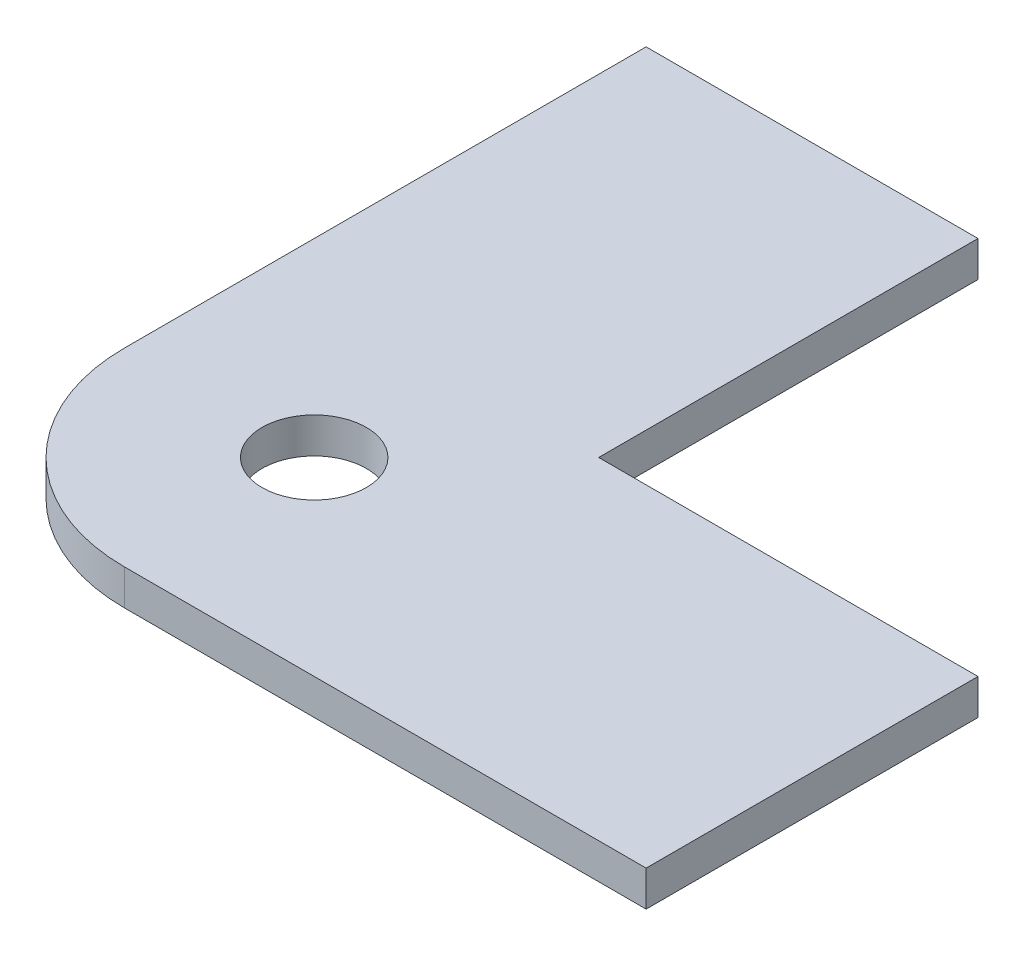
ISO-10303-21;
HEADER;
FILE_DESCRIPTION(('STEP AP214'),'2;1');
FILE_NAME('part.step','',(''),(''),'','','');
FILE_SCHEMA(('AUTOMOTIVE_DESIGN { 1 0 10303 214 1 1 1 1 }'));
ENDSEC;
DATA;
#1=APPLICATION_CONTEXT('core data for automotive mechanical design processes');
#2=APPLICATION_PROTOCOL_DEFINITION('international standard','automotive_design',2000,#1);
#3=PRODUCT_CONTEXT('',#1,'mechanical');
#4=PRODUCT('Part','Part','',(#3));
#5=PRODUCT_RELATED_PRODUCT_CATEGORY('part','',(#4));
#6=PRODUCT_DEFINITION_FORMATION('','',#4);
#7=PRODUCT_DEFINITION_CONTEXT('part definition',#1,'design');
#8=PRODUCT_DEFINITION('design','',#6,#7);
#9=PRODUCT_DEFINITION_SHAPE('','',#8);
#10=(LENGTH_UNIT() NAMED_UNIT(*) SI_UNIT(.MILLI.,.METRE.));
#11=(NAMED_UNIT(*) PLANE_ANGLE_UNIT() SI_UNIT($,.RADIAN.));
#12=(NAMED_UNIT(*) SI_UNIT($,.STERADIAN.) SOLID_ANGLE_UNIT());
#13=UNCERTAINTY_MEASURE_WITH_UNIT(LENGTH_MEASURE(1.E-05),#10,'distance_accuracy_value','');
#14=(GEOMETRIC_REPRESENTATION_CONTEXT(3) GLOBAL_UNCERTAINTY_ASSIGNED_CONTEXT((#13)) GLOBAL_UNIT_ASSIGNED_CONTEXT((#10,
#11,#12)) REPRESENTATION_CONTEXT('',''));
#15=CARTESIAN_POINT('',(0.,0.,0.));
#16=DIRECTION('',(0.,0.,1.));
#17=DIRECTION('',(1.,0.,0.));
#18=AXIS2_PLACEMENT_3D('',#15,#16,#17);
#19=CARTESIAN_POINT('',(0.,0.75,3.99967418048264));
#20=DIRECTION('',(0.,0.,-1.));
#21=DIRECTION('',(-1.,0.,0.));
#22=AXIS2_PLACEMENT_3D('',#19,#20,#21);
#23=PLANE('',#22);
#24=DIRECTION('',(1.,0.,0.));
#25=VECTOR('',#24,1.);
#26=CARTESIAN_POINT('',(0.,0.,3.99967418048264));
#27=LINE('',#26,#25);
#28=CARTESIAN_POINT('',(0.,0.,3.99967418048264));
#29=VERTEX_POINT('',#28);
#30=CARTESIAN_POINT('',(11.,0.,3.99967418048264));
#31=VERTEX_POINT('',#30);
#32=EDGE_CURVE('E142',#29,#31,#27,.T.);
#33=ORIENTED_EDGE('',*,*,#32,.T.);
#34=DIRECTION('',(0.,-1.,0.));
#35=VECTOR('',#34,1.);
#36=CARTESIAN_POINT('',(11.,0.75,3.99967418048264));
#37=LINE('',#36,#35);
#38=CARTESIAN_POINT('',(11.,0.75,3.99967418048264));
#39=VERTEX_POINT('',#38);
#40=EDGE_CURVE('E11',#39,#31,#37,.T.);
#41=ORIENTED_EDGE('',*,*,#40,.F.);
#42=DIRECTION('',(1.,0.,0.));
#43=VECTOR('',#42,1.);
#44=CARTESIAN_POINT('',(0.,0.75,3.99967418048264));
#45=LINE('',#44,#43);
#46=CARTESIAN_POINT('',(0.,0.75,3.99967418048264));
#47=VERTEX_POINT('',#46);
#48=EDGE_CURVE('E170',#47,#39,#45,.T.);
#49=ORIENTED_EDGE('',*,*,#48,.F.);
#50=DIRECTION('',(0.,-1.,0.));
#51=VECTOR('',#50,1.);
#52=CARTESIAN_POINT('',(0.,0.75,3.99967418048264));
#53=LINE('',#52,#51);
#54=EDGE_CURVE('E58',#47,#29,#53,.T.);
#55=ORIENTED_EDGE('',*,*,#54,.T.);
#56=EDGE_LOOP('',(#33,#41,#49,#55));
#57=FACE_BOUND('',#56,.T.);
#58=ADVANCED_FACE('F41',(#57),#23,.F.);
#59=CARTESIAN_POINT('',(11.,0.75,0.));
#60=DIRECTION('',(-1.,0.,0.));
#61=DIRECTION('',(0.,0.,1.));
#62=AXIS2_PLACEMENT_3D('',#59,#60,#61);
#63=PLANE('',#62);
#64=DIRECTION('',(0.,0.,-1.));
#65=VECTOR('',#64,1.);
#66=CARTESIAN_POINT('',(11.,0.,0.));
#67=LINE('',#66,#65);
#68=CARTESIAN_POINT('',(11.,0.,-3.));
#69=VERTEX_POINT('',#68);
#70=EDGE_CURVE('E145',#31,#69,#67,.T.);
#71=ORIENTED_EDGE('',*,*,#70,.T.);
#72=DIRECTION('',(0.,-1.,0.));
#73=VECTOR('',#72,1.);
#74=CARTESIAN_POINT('',(11.,0.75,-3.));
#75=LINE('',#74,#73);
#76=CARTESIAN_POINT('',(11.,0.75,-3.));
#77=VERTEX_POINT('',#76);
#78=EDGE_CURVE('E50',#77,#69,#75,.T.);
#79=ORIENTED_EDGE('',*,*,#78,.F.);
#80=DIRECTION('',(0.,0.,-1.));
#81=VECTOR('',#80,1.);
#82=CARTESIAN_POINT('',(11.,0.75,0.));
#83=LINE('',#82,#81);
#84=EDGE_CURVE('E93',#39,#77,#83,.T.);
#85=ORIENTED_EDGE('',*,*,#84,.F.);
#86=ORIENTED_EDGE('',*,*,#40,.T.);
#87=EDGE_LOOP('',(#71,#79,#85,#86));
#88=FACE_BOUND('',#87,.T.);
#89=ADVANCED_FACE('F185',(#88),#63,.F.);
#90=CARTESIAN_POINT('',(0.,0.75,-3.));
#91=DIRECTION('',(0.,0.,-1.));
#92=DIRECTION('',(-1.,0.,0.));
#93=AXIS2_PLACEMENT_3D('',#90,#91,#92);
#94=PLANE('',#93);
#95=DIRECTION('',(1.,0.,0.));
#96=VECTOR('',#95,1.);
#97=CARTESIAN_POINT('',(0.,0.,-3.));
#98=LINE('',#97,#96);
#99=CARTESIAN_POINT('',(3.,0.,-3.));
#100=VERTEX_POINT('',#99);
#101=EDGE_CURVE('E149',#100,#69,#98,.T.);
#102=ORIENTED_EDGE('',*,*,#101,.F.);
#103=DIRECTION('',(0.,-1.,0.));
#104=VECTOR('',#103,1.);
#105=CARTESIAN_POINT('',(3.,0.75,-3.));
#106=LINE('',#105,#104);
#107=CARTESIAN_POINT('',(3.,0.75,-3.));
#108=VERTEX_POINT('',#107);
#109=EDGE_CURVE('E177',#108,#100,#106,.T.);
#110=ORIENTED_EDGE('',*,*,#109,.F.);
#111=DIRECTION('',(1.,0.,0.));
#112=VECTOR('',#111,1.);
#113=CARTESIAN_POINT('',(0.,0.75,-3.));
#114=LINE('',#113,#112);
#115=EDGE_CURVE('E184',#108,#77,#114,.T.);
#116=ORIENTED_EDGE('',*,*,#115,.T.);
#117=ORIENTED_EDGE('',*,*,#78,.T.);
#118=EDGE_LOOP('',(#102,#110,#116,#117));
#119=FACE_BOUND('',#118,.T.);
#120=ADVANCED_FACE('F183',(#119),#94,.T.);
#121=CARTESIAN_POINT('',(3.,0.75,0.));
#122=DIRECTION('',(1.,0.,0.));
#123=DIRECTION('',(0.,0.,-1.));
#124=AXIS2_PLACEMENT_3D('',#121,#122,#123);
#125=PLANE('',#124);
#126=DIRECTION('',(0.,0.,1.));
#127=VECTOR('',#126,1.);
#128=CARTESIAN_POINT('',(3.,0.,0.));
#129=LINE('',#128,#127);
#130=CARTESIAN_POINT('',(3.,0.,-11.));
#131=VERTEX_POINT('',#130);
#132=EDGE_CURVE('E153',#131,#100,#129,.T.);
#133=ORIENTED_EDGE('',*,*,#132,.F.);
#134=DIRECTION('',(0.,-1.,0.));
#135=VECTOR('',#134,1.);
#136=CARTESIAN_POINT('',(3.,0.75,-11.));
#137=LINE('',#136,#135);
#138=CARTESIAN_POINT('',(3.,0.75,-11.));
#139=VERTEX_POINT('',#138);
#140=EDGE_CURVE('E116',#139,#131,#137,.T.);
#141=ORIENTED_EDGE('',*,*,#140,.F.);
#142=DIRECTION('',(0.,0.,1.));
#143=VECTOR('',#142,1.);
#144=CARTESIAN_POINT('',(3.,0.75,0.));
#145=LINE('',#144,#143);
#146=EDGE_CURVE('E127',#139,#108,#145,.T.);
#147=ORIENTED_EDGE('',*,*,#146,.T.);
#148=ORIENTED_EDGE('',*,*,#109,.T.);
#149=EDGE_LOOP('',(#133,#141,#147,#148));
#150=FACE_BOUND('',#149,.T.);
#151=ADVANCED_FACE('F192',(#150),#125,.T.);
#152=CARTESIAN_POINT('',(0.,0.75,-11.));
#153=DIRECTION('',(0.,0.,-1.));
#154=DIRECTION('',(-1.,0.,0.));
#155=AXIS2_PLACEMENT_3D('',#152,#153,#154);
#156=PLANE('',#155);
#157=DIRECTION('',(1.,0.,0.));
#158=VECTOR('',#157,1.);
#159=CARTESIAN_POINT('',(0.,0.,-11.));
#160=LINE('',#159,#158);
#161=CARTESIAN_POINT('',(-3.99967418048264,0.,-11.));
#162=VERTEX_POINT('',#161);
#163=EDGE_CURVE('E111',#162,#131,#160,.T.);
#164=ORIENTED_EDGE('',*,*,#163,.F.);
#165=DIRECTION('',(0.,-1.,0.));
#166=VECTOR('',#165,1.);
#167=CARTESIAN_POINT('',(-3.99967418048264,0.75,-11.));
#168=LINE('',#167,#166);
#169=CARTESIAN_POINT('',(-3.99967418048264,0.75,-11.));
#170=VERTEX_POINT('',#169);
#171=EDGE_CURVE('E106',#170,#162,#168,.T.);
#172=ORIENTED_EDGE('',*,*,#171,.F.);
#173=DIRECTION('',(1.,0.,0.));
#174=VECTOR('',#173,1.);
#175=CARTESIAN_POINT('',(0.,0.75,-11.));
#176=LINE('',#175,#174);
#177=EDGE_CURVE('E109',#170,#139,#176,.T.);
#178=ORIENTED_EDGE('',*,*,#177,.T.);
#179=ORIENTED_EDGE('',*,*,#140,.T.);
#180=EDGE_LOOP('',(#164,#172,#178,#179));
#181=FACE_BOUND('',#180,.T.);
#182=ADVANCED_FACE('F108',(#181),#156,.T.);
#183=CARTESIAN_POINT('',(-3.99967418048264,0.75,0.));
#184=DIRECTION('',(-1.,0.,0.));
#185=DIRECTION('',(0.,0.,1.));
#186=AXIS2_PLACEMENT_3D('',#183,#184,#185);
#187=PLANE('',#186);
#188=DIRECTION('',(0.,0.,-1.));
#189=VECTOR('',#188,1.);
#190=CARTESIAN_POINT('',(-3.99967418048264,0.,0.));
#191=LINE('',#190,#189);
#192=CARTESIAN_POINT('',(-3.99967418048264,0.,0.));
#193=VERTEX_POINT('',#192);
#194=EDGE_CURVE('E159',#193,#162,#191,.T.);
#195=ORIENTED_EDGE('',*,*,#194,.F.);
#196=DIRECTION('',(0.,-1.,0.));
#197=VECTOR('',#196,1.);
#198=CARTESIAN_POINT('',(-3.99967418048264,0.75,0.));
#199=LINE('',#198,#197);
#200=CARTESIAN_POINT('',(-3.99967418048264,0.75,0.));
#201=VERTEX_POINT('',#200);
#202=EDGE_CURVE('E81',#201,#193,#199,.T.);
#203=ORIENTED_EDGE('',*,*,#202,.F.);
#204=DIRECTION('',(0.,0.,-1.));
#205=VECTOR('',#204,1.);
#206=CARTESIAN_POINT('',(-3.99967418048264,0.75,0.));
#207=LINE('',#206,#205);
#208=EDGE_CURVE('E124',#201,#170,#207,.T.);
#209=ORIENTED_EDGE('',*,*,#208,.T.);
#210=ORIENTED_EDGE('',*,*,#171,.T.);
#211=EDGE_LOOP('',(#195,#203,#209,#210));
#212=FACE_BOUND('',#211,.T.);
#213=ADVANCED_FACE('F130',(#212),#187,.T.);
#214=CARTESIAN_POINT('',(0.,0.75,0.));
#215=DIRECTION('',(0.,-1.,0.));
#216=DIRECTION('',(0.,0.,-1.));
#217=AXIS2_PLACEMENT_3D('',#214,#215,#216);
#218=CYLINDRICAL_SURFACE('',#217,3.99967418048264);
#219=CARTESIAN_POINT('',(0.,0.,0.));
#220=DIRECTION('',(0.,1.,0.));
#221=DIRECTION('',(0.,0.,1.));
#222=AXIS2_PLACEMENT_3D('',#219,#220,#221);
#223=CIRCLE('',#222,3.99967418048264);
#224=EDGE_CURVE('E162',#29,#193,#223,.F.);
#225=ORIENTED_EDGE('',*,*,#224,.F.);
#226=ORIENTED_EDGE('',*,*,#54,.F.);
#227=CARTESIAN_POINT('',(0.,0.75,0.));
#228=DIRECTION('',(0.,1.,0.));
#229=DIRECTION('',(0.,0.,1.));
#230=AXIS2_PLACEMENT_3D('',#227,#228,#229);
#231=CIRCLE('',#230,3.99967418048264);
#232=EDGE_CURVE('E132',#47,#201,#231,.F.);
#233=ORIENTED_EDGE('',*,*,#232,.T.);
#234=ORIENTED_EDGE('',*,*,#202,.T.);
#235=EDGE_LOOP('',(#225,#226,#233,#234));
#236=FACE_BOUND('',#235,.T.);
#237=ADVANCED_FACE('F200',(#236),#218,.T.);
#238=CARTESIAN_POINT('',(0.,0.75,0.));
#239=DIRECTION('',(0.,-1.,0.));
#240=DIRECTION('',(0.,0.,-1.));
#241=AXIS2_PLACEMENT_3D('',#238,#239,#240);
#242=CYLINDRICAL_SURFACE('',#241,1.1);
#243=CARTESIAN_POINT('',(0.,0.75,0.));
#244=DIRECTION('',(0.,1.,0.));
#245=DIRECTION('',(0.,0.,1.));
#246=AXIS2_PLACEMENT_3D('',#243,#244,#245);
#247=CIRCLE('',#246,1.1);
#248=CARTESIAN_POINT('',(0.,0.75,1.1));
#249=VERTEX_POINT('',#248);
#250=EDGE_CURVE('E135',#249,#249,#247,.T.);
#251=ORIENTED_EDGE('',*,*,#250,.T.);
#252=EDGE_LOOP('',(#251));
#253=FACE_BOUND('',#252,.T.);
#254=CARTESIAN_POINT('',(0.,0.,0.));
#255=DIRECTION('',(0.,1.,0.));
#256=DIRECTION('',(0.,0.,1.));
#257=AXIS2_PLACEMENT_3D('',#254,#255,#256);
#258=CIRCLE('',#257,1.1);
#259=CARTESIAN_POINT('',(0.,0.,1.1));
#260=VERTEX_POINT('',#259);
#261=EDGE_CURVE('E166',#260,#260,#258,.T.);
#262=ORIENTED_EDGE('',*,*,#261,.F.);
#263=EDGE_LOOP('',(#262));
#264=FACE_BOUND('',#263,.T.);
#265=ADVANCED_FACE('F202',(#253,#264),#242,.F.);
#266=CARTESIAN_POINT('',(0.,0.75,0.));
#267=DIRECTION('',(0.,1.,0.));
#268=DIRECTION('',(0.,0.,1.));
#269=AXIS2_PLACEMENT_3D('',#266,#267,#268);
#270=PLANE('',#269);
#271=ORIENTED_EDGE('',*,*,#48,.T.);
#272=ORIENTED_EDGE('',*,*,#84,.T.);
#273=ORIENTED_EDGE('',*,*,#115,.F.);
#274=ORIENTED_EDGE('',*,*,#146,.F.);
#275=ORIENTED_EDGE('',*,*,#177,.F.);
#276=ORIENTED_EDGE('',*,*,#208,.F.);
#277=ORIENTED_EDGE('',*,*,#232,.F.);
#278=EDGE_LOOP('',(#271,#272,#273,#274,#275,#276,#277));
#279=FACE_BOUND('',#278,.T.);
#280=ORIENTED_EDGE('',*,*,#250,.F.);
#281=EDGE_LOOP('',(#280));
#282=FACE_BOUND('',#281,.T.);
#283=ADVANCED_FACE('F121',(#279,#282),#270,.T.);
#284=CARTESIAN_POINT('',(0.,0.,0.));
#285=DIRECTION('',(0.,1.,0.));
#286=DIRECTION('',(0.,0.,1.));
#287=AXIS2_PLACEMENT_3D('',#284,#285,#286);
#288=PLANE('',#287);
#289=ORIENTED_EDGE('',*,*,#32,.F.);
#290=ORIENTED_EDGE('',*,*,#224,.T.);
#291=ORIENTED_EDGE('',*,*,#194,.T.);
#292=ORIENTED_EDGE('',*,*,#163,.T.);
#293=ORIENTED_EDGE('',*,*,#132,.T.);
#294=ORIENTED_EDGE('',*,*,#101,.T.);
#295=ORIENTED_EDGE('',*,*,#70,.F.);
#296=EDGE_LOOP('',(#289,#290,#291,#292,#293,#294,#295));
#297=FACE_BOUND('',#296,.T.);
#298=ORIENTED_EDGE('',*,*,#261,.T.);
#299=EDGE_LOOP('',(#298));
#300=FACE_BOUND('',#299,.T.);
#301=ADVANCED_FACE('F188',(#297,#300),#288,.F.);
#302=CLOSED_SHELL('',(#58,#89,#120,#151,#182,#213,#237,#265,#283,#301));
#303=MANIFOLD_SOLID_BREP('B2',#302);
#304=ADVANCED_BREP_SHAPE_REPRESENTATION('',(#18,#303),#14);
#305=SHAPE_DEFINITION_REPRESENTATION(#9,#304);
ENDSEC;
END-ISO-10303-21;
